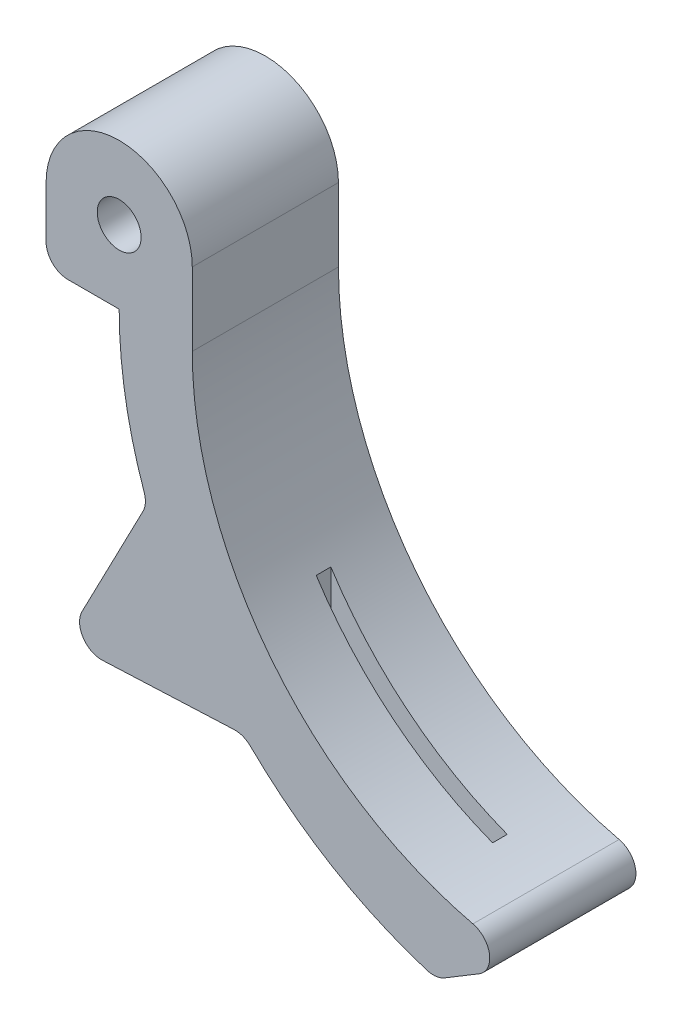
ISO-10303-21;
HEADER;
FILE_DESCRIPTION(('STEP AP214'),'2;1');
FILE_NAME('part.step','',(''),(''),'','','');
FILE_SCHEMA(('AUTOMOTIVE_DESIGN { 1 0 10303 214 1 1 1 1 }'));
ENDSEC;
DATA;
#1=APPLICATION_CONTEXT('core data for automotive mechanical design processes');
#2=APPLICATION_PROTOCOL_DEFINITION('international standard','automotive_design',2000,#1);
#3=PRODUCT_CONTEXT('',#1,'mechanical');
#4=PRODUCT('Part','Part','',(#3));
#5=PRODUCT_RELATED_PRODUCT_CATEGORY('part','',(#4));
#6=PRODUCT_DEFINITION_FORMATION('','',#4);
#7=PRODUCT_DEFINITION_CONTEXT('part definition',#1,'design');
#8=PRODUCT_DEFINITION('design','',#6,#7);
#9=PRODUCT_DEFINITION_SHAPE('','',#8);
#10=(LENGTH_UNIT() NAMED_UNIT(*) SI_UNIT(.MILLI.,.METRE.));
#11=(NAMED_UNIT(*) PLANE_ANGLE_UNIT() SI_UNIT($,.RADIAN.));
#12=(NAMED_UNIT(*) SI_UNIT($,.STERADIAN.) SOLID_ANGLE_UNIT());
#13=UNCERTAINTY_MEASURE_WITH_UNIT(LENGTH_MEASURE(1.E-05),#10,'distance_accuracy_value','');
#14=(GEOMETRIC_REPRESENTATION_CONTEXT(3) GLOBAL_UNCERTAINTY_ASSIGNED_CONTEXT((#13)) GLOBAL_UNIT_ASSIGNED_CONTEXT((#10,
#11,#12)) REPRESENTATION_CONTEXT('',''));
#15=CARTESIAN_POINT('',(0.,0.,0.));
#16=DIRECTION('',(0.,0.,1.));
#17=DIRECTION('',(1.,0.,0.));
#18=AXIS2_PLACEMENT_3D('',#15,#16,#17);
#19=CARTESIAN_POINT('',(30.,-5.,10.));
#20=DIRECTION('',(0.,0.,-1.));
#21=DIRECTION('',(-1.,0.,0.));
#22=AXIS2_PLACEMENT_3D('',#19,#20,#21);
#23=CYLINDRICAL_SURFACE('',#22,29.9999989888262);
#24=CARTESIAN_POINT('',(30.,-5.,4.5));
#25=DIRECTION('',(0.,0.,1.));
#26=DIRECTION('',(1.,0.,0.));
#27=AXIS2_PLACEMENT_3D('',#24,#25,#26);
#28=CIRCLE('',#27,29.9999989888262);
#29=CARTESIAN_POINT('',(8.97863673824008,-26.4033227781741,4.5));
#30=VERTEX_POINT('',#29);
#31=CARTESIAN_POINT('',(21.0443812891128,-33.6320944542096,4.5));
#32=VERTEX_POINT('',#31);
#33=EDGE_CURVE('E329',#30,#32,#28,.T.);
#34=ORIENTED_EDGE('',*,*,#33,.F.);
#35=DIRECTION('',(0.,0.,-1.));
#36=VECTOR('',#35,1.);
#37=CARTESIAN_POINT('',(8.97863673824008,-26.4033227781741,10.));
#38=LINE('',#37,#36);
#39=CARTESIAN_POINT('',(8.97863673824008,-26.4033227781741,0.));
#40=VERTEX_POINT('',#39);
#41=EDGE_CURVE('E200',#30,#40,#38,.T.);
#42=ORIENTED_EDGE('',*,*,#41,.T.);
#43=CARTESIAN_POINT('',(30.,-5.,0.));
#44=DIRECTION('',(0.,0.,1.));
#45=DIRECTION('',(1.,0.,0.));
#46=AXIS2_PLACEMENT_3D('',#43,#44,#45);
#47=CIRCLE('',#46,29.9999989888262);
#48=CARTESIAN_POINT('',(21.0443812891128,-33.6320944542096,0.));
#49=VERTEX_POINT('',#48);
#50=EDGE_CURVE('E291',#40,#49,#47,.T.);
#51=ORIENTED_EDGE('',*,*,#50,.T.);
#52=DIRECTION('',(0.,0.,-1.));
#53=VECTOR('',#52,1.);
#54=CARTESIAN_POINT('',(21.0443812891128,-33.6320944542096,10.));
#55=LINE('',#54,#53);
#56=EDGE_CURVE('E210',#49,#32,#55,.F.);
#57=ORIENTED_EDGE('',*,*,#56,.T.);
#58=EDGE_LOOP('',(#34,#42,#51,#57));
#59=FACE_BOUND('',#58,.T.);
#60=ADVANCED_FACE('F37',(#59),#23,.T.);
#61=CARTESIAN_POINT('',(30.,-5.,5.5));
#62=DIRECTION('',(0.,0.,-1.));
#63=DIRECTION('',(-1.,0.,0.));
#64=AXIS2_PLACEMENT_3D('',#61,#62,#63);
#65=CIRCLE('',#64,29.9999989888262);
#66=CARTESIAN_POINT('',(21.0443812891128,-33.6320944542096,5.5));
#67=VERTEX_POINT('',#66);
#68=CARTESIAN_POINT('',(8.97863673824008,-26.4033227781741,5.5));
#69=VERTEX_POINT('',#68);
#70=EDGE_CURVE('E172',#67,#69,#65,.T.);
#71=ORIENTED_EDGE('',*,*,#70,.F.);
#72=CARTESIAN_POINT('',(21.0443812891128,-33.6320944542096,10.));
#73=VERTEX_POINT('',#72);
#74=EDGE_CURVE('E216',#67,#73,#55,.F.);
#75=ORIENTED_EDGE('',*,*,#74,.T.);
#76=CARTESIAN_POINT('',(30.,-5.,10.));
#77=DIRECTION('',(0.,0.,1.));
#78=DIRECTION('',(1.,0.,0.));
#79=AXIS2_PLACEMENT_3D('',#76,#77,#78);
#80=CIRCLE('',#79,29.9999989888262);
#81=CARTESIAN_POINT('',(8.97863673824008,-26.4033227781741,10.));
#82=VERTEX_POINT('',#81);
#83=EDGE_CURVE('E205',#82,#73,#80,.T.);
#84=ORIENTED_EDGE('',*,*,#83,.F.);
#85=EDGE_CURVE('E198',#82,#69,#38,.T.);
#86=ORIENTED_EDGE('',*,*,#85,.T.);
#87=EDGE_LOOP('',(#71,#75,#84,#86));
#88=FACE_BOUND('',#87,.T.);
#89=ADVANCED_FACE('F203',(#88),#23,.T.);
#90=CARTESIAN_POINT('',(30.,-5.,10.));
#91=DIRECTION('',(0.,0.,-1.));
#92=DIRECTION('',(-1.,0.,0.));
#93=AXIS2_PLACEMENT_3D('',#90,#91,#92);
#94=CYLINDRICAL_SURFACE('',#93,25.);
#95=CARTESIAN_POINT('',(30.,-5.,10.));
#96=DIRECTION('',(0.,0.,1.));
#97=DIRECTION('',(1.,0.,0.));
#98=AXIS2_PLACEMENT_3D('',#95,#96,#97);
#99=CIRCLE('',#98,25.);
#100=CARTESIAN_POINT('',(5.,-5.,10.));
#101=VERTEX_POINT('',#100);
#102=CARTESIAN_POINT('',(24.197357034,-29.3172641267296,10.));
#103=VERTEX_POINT('',#102);
#104=EDGE_CURVE('E313',#101,#103,#99,.T.);
#105=ORIENTED_EDGE('',*,*,#104,.T.);
#106=DIRECTION('',(0.,0.,-1.));
#107=VECTOR('',#106,1.);
#108=CARTESIAN_POINT('',(24.197357034,-29.3172641267296,10.));
#109=LINE('',#108,#107);
#110=CARTESIAN_POINT('',(24.197357034,-29.3172641267296,0.));
#111=VERTEX_POINT('',#110);
#112=EDGE_CURVE('E364',#103,#111,#109,.T.);
#113=ORIENTED_EDGE('',*,*,#112,.T.);
#114=CARTESIAN_POINT('',(30.,-5.,0.));
#115=DIRECTION('',(0.,0.,1.));
#116=DIRECTION('',(1.,0.,0.));
#117=AXIS2_PLACEMENT_3D('',#114,#115,#116);
#118=CIRCLE('',#117,25.);
#119=CARTESIAN_POINT('',(5.,-5.,0.));
#120=VERTEX_POINT('',#119);
#121=EDGE_CURVE('E285',#120,#111,#118,.T.);
#122=ORIENTED_EDGE('',*,*,#121,.F.);
#123=DIRECTION('',(0.,0.,-1.));
#124=VECTOR('',#123,1.);
#125=CARTESIAN_POINT('',(5.,-5.,10.));
#126=LINE('',#125,#124);
#127=EDGE_CURVE('E257',#101,#120,#126,.T.);
#128=ORIENTED_EDGE('',*,*,#127,.F.);
#129=EDGE_LOOP('',(#105,#113,#122,#128));
#130=FACE_BOUND('',#129,.T.);
#131=CARTESIAN_POINT('',(30.,-5.,4.5));
#132=DIRECTION('',(0.,0.,1.));
#133=DIRECTION('',(1.,0.,0.));
#134=AXIS2_PLACEMENT_3D('',#131,#132,#133);
#135=CIRCLE('',#134,25.);
#136=CARTESIAN_POINT('',(8.97863673824008,-18.5315293524838,4.5));
#137=VERTEX_POINT('',#136);
#138=CARTESIAN_POINT('',(21.0443812891128,-28.3408845913176,4.5));
#139=VERTEX_POINT('',#138);
#140=EDGE_CURVE('E179',#137,#139,#135,.T.);
#141=ORIENTED_EDGE('',*,*,#140,.T.);
#142=DIRECTION('',(0.,0.,-1.));
#143=VECTOR('',#142,1.);
#144=CARTESIAN_POINT('',(21.0443812891128,-28.3408845913176,10.));
#145=LINE('',#144,#143);
#146=CARTESIAN_POINT('',(21.0443812891128,-28.3408845913176,5.5));
#147=VERTEX_POINT('',#146);
#148=EDGE_CURVE('E326',#139,#147,#145,.F.);
#149=ORIENTED_EDGE('',*,*,#148,.T.);
#150=CARTESIAN_POINT('',(30.,-5.,5.5));
#151=DIRECTION('',(0.,0.,-1.));
#152=DIRECTION('',(-1.,0.,0.));
#153=AXIS2_PLACEMENT_3D('',#150,#151,#152);
#154=CIRCLE('',#153,25.);
#155=CARTESIAN_POINT('',(8.97863673824009,-18.5315293524838,5.5));
#156=VERTEX_POINT('',#155);
#157=EDGE_CURVE('E180',#147,#156,#154,.T.);
#158=ORIENTED_EDGE('',*,*,#157,.T.);
#159=DIRECTION('',(0.,0.,-1.));
#160=VECTOR('',#159,1.);
#161=CARTESIAN_POINT('',(8.97863673824009,-18.5315293524838,10.));
#162=LINE('',#161,#160);
#163=EDGE_CURVE('E189',#156,#137,#162,.T.);
#164=ORIENTED_EDGE('',*,*,#163,.T.);
#165=EDGE_LOOP('',(#141,#149,#158,#164));
#166=FACE_BOUND('',#165,.T.);
#167=ADVANCED_FACE('F345',(#130,#166),#94,.F.);
#168=CARTESIAN_POINT('',(1.1615210425008,-26.2711692628957,10.));
#169=DIRECTION('',(-0.0441696157527553,0.999024046279295,0.));
#170=DIRECTION('',(-0.999024046279295,-0.0441696157527553,0.));
#171=AXIS2_PLACEMENT_3D('',#168,#169,#170);
#172=PLANE('',#171);
#173=DIRECTION('',(0.999024046279295,0.0441696157527553,0.));
#174=VECTOR('',#173,1.);
#175=CARTESIAN_POINT('',(1.1615210425008,-26.2711692628957,10.));
#176=LINE('',#175,#174);
#177=CARTESIAN_POINT('',(-1.14277252574677,-26.3730484537621,10.));
#178=VERTEX_POINT('',#177);
#179=CARTESIAN_POINT('',(7.86131411609586,-25.9749528837346,10.));
#180=VERTEX_POINT('',#179);
#181=EDGE_CURVE('E320',#178,#180,#176,.T.);
#182=ORIENTED_EDGE('',*,*,#181,.F.);
#183=DIRECTION('',(0.,0.,-1.));
#184=VECTOR('',#183,1.);
#185=CARTESIAN_POINT('',(-1.14277252574677,-26.3730484537621,10.));
#186=LINE('',#185,#184);
#187=CARTESIAN_POINT('',(-1.14277252574677,-26.3730484537621,0.));
#188=VERTEX_POINT('',#187);
#189=EDGE_CURVE('E219',#178,#188,#186,.T.);
#190=ORIENTED_EDGE('',*,*,#189,.T.);
#191=DIRECTION('',(0.999024046279295,0.0441696157527553,0.));
#192=VECTOR('',#191,1.);
#193=CARTESIAN_POINT('',(1.1615210425008,-26.2711692628957,0.));
#194=LINE('',#193,#192);
#195=CARTESIAN_POINT('',(7.86131411609586,-25.9749528837346,0.));
#196=VERTEX_POINT('',#195);
#197=EDGE_CURVE('E293',#188,#196,#194,.T.);
#198=ORIENTED_EDGE('',*,*,#197,.T.);
#199=DIRECTION('',(0.,0.,1.));
#200=VECTOR('',#199,1.);
#201=CARTESIAN_POINT('',(7.86131411609586,-25.9749528837346,10.));
#202=LINE('',#201,#200);
#203=EDGE_CURVE('E221',#196,#180,#202,.T.);
#204=ORIENTED_EDGE('',*,*,#203,.T.);
#205=EDGE_LOOP('',(#182,#190,#198,#204));
#206=FACE_BOUND('',#205,.T.);
#207=ADVANCED_FACE('F418',(#206),#172,.F.);
#208=CARTESIAN_POINT('',(20.7766465222511,-34.3853827896279,10.));
#209=DIRECTION('',(0.517154742988662,-0.855891915959212,0.));
#210=DIRECTION('',(0.855891915959212,0.517154742988662,0.));
#211=AXIS2_PLACEMENT_3D('',#208,#209,#210);
#212=PLANE('',#211);
#213=DIRECTION('',(-0.855891915959212,-0.517154742988662,0.));
#214=VECTOR('',#213,1.);
#215=CARTESIAN_POINT('',(20.7766465222511,-34.3853827896279,10.));
#216=LINE('',#215,#214);
#217=CARTESIAN_POINT('',(24.624930570523,-32.0601378482722,10.));
#218=VERTEX_POINT('',#217);
#219=CARTESIAN_POINT('',(22.267894354233,-33.4843275571846,10.));
#220=VERTEX_POINT('',#219);
#221=EDGE_CURVE('E316',#218,#220,#216,.T.);
#222=ORIENTED_EDGE('',*,*,#221,.T.);
#223=DIRECTION('',(0.,0.,1.));
#224=VECTOR('',#223,1.);
#225=CARTESIAN_POINT('',(22.267894354233,-33.4843275571846,0.));
#226=LINE('',#225,#224);
#227=CARTESIAN_POINT('',(22.267894354233,-33.4843275571846,0.));
#228=VERTEX_POINT('',#227);
#229=EDGE_CURVE('E207',#220,#228,#226,.F.);
#230=ORIENTED_EDGE('',*,*,#229,.T.);
#231=DIRECTION('',(-0.855891915959212,-0.517154742988662,0.));
#232=VECTOR('',#231,1.);
#233=CARTESIAN_POINT('',(20.7766465222511,-34.3853827896279,0.));
#234=LINE('',#233,#232);
#235=CARTESIAN_POINT('',(24.624930570523,-32.0601378482722,0.));
#236=VERTEX_POINT('',#235);
#237=EDGE_CURVE('E288',#236,#228,#234,.T.);
#238=ORIENTED_EDGE('',*,*,#237,.F.);
#239=DIRECTION('',(0.,0.,-1.));
#240=VECTOR('',#239,1.);
#241=CARTESIAN_POINT('',(24.624930570523,-32.0601378482722,10.));
#242=LINE('',#241,#240);
#243=EDGE_CURVE('E206',#236,#218,#242,.F.);
#244=ORIENTED_EDGE('',*,*,#243,.T.);
#245=EDGE_LOOP('',(#222,#230,#238,#244));
#246=FACE_BOUND('',#245,.T.);
#247=ADVANCED_FACE('F358',(#246),#212,.T.);
#248=CARTESIAN_POINT('',(5.,0.,10.));
#249=DIRECTION('',(1.,0.,0.));
#250=DIRECTION('',(0.,1.,0.));
#251=AXIS2_PLACEMENT_3D('',#248,#249,#250);
#252=PLANE('',#251);
#253=DIRECTION('',(0.,-1.,0.));
#254=VECTOR('',#253,1.);
#255=CARTESIAN_POINT('',(5.,0.,0.));
#256=LINE('',#255,#254);
#257=CARTESIAN_POINT('',(5.,0.,0.));
#258=VERTEX_POINT('',#257);
#259=EDGE_CURVE('E282',#258,#120,#256,.T.);
#260=ORIENTED_EDGE('',*,*,#259,.F.);
#261=DIRECTION('',(0.,0.,-1.));
#262=VECTOR('',#261,1.);
#263=CARTESIAN_POINT('',(5.,0.,10.));
#264=LINE('',#263,#262);
#265=CARTESIAN_POINT('',(5.,0.,10.));
#266=VERTEX_POINT('',#265);
#267=EDGE_CURVE('E259',#266,#258,#264,.T.);
#268=ORIENTED_EDGE('',*,*,#267,.F.);
#269=DIRECTION('',(0.,-1.,0.));
#270=VECTOR('',#269,1.);
#271=CARTESIAN_POINT('',(5.,0.,10.));
#272=LINE('',#271,#270);
#273=EDGE_CURVE('E310',#266,#101,#272,.T.);
#274=ORIENTED_EDGE('',*,*,#273,.T.);
#275=ORIENTED_EDGE('',*,*,#127,.T.);
#276=EDGE_LOOP('',(#260,#268,#274,#275));
#277=FACE_BOUND('',#276,.T.);
#278=ADVANCED_FACE('F371',(#277),#252,.T.);
#279=CARTESIAN_POINT('',(0.,0.,10.));
#280=DIRECTION('',(0.,0.,-1.));
#281=DIRECTION('',(-1.,0.,0.));
#282=AXIS2_PLACEMENT_3D('',#279,#280,#281);
#283=CYLINDRICAL_SURFACE('',#282,5.);
#284=CARTESIAN_POINT('',(0.,0.,0.));
#285=DIRECTION('',(0.,0.,1.));
#286=DIRECTION('',(1.,0.,0.));
#287=AXIS2_PLACEMENT_3D('',#284,#285,#286);
#288=CIRCLE('',#287,5.);
#289=CARTESIAN_POINT('',(-5.,0.,0.));
#290=VERTEX_POINT('',#289);
#291=EDGE_CURVE('E280',#258,#290,#288,.T.);
#292=ORIENTED_EDGE('',*,*,#291,.T.);
#293=DIRECTION('',(0.,0.,-1.));
#294=VECTOR('',#293,1.);
#295=CARTESIAN_POINT('',(-5.,0.,10.));
#296=LINE('',#295,#294);
#297=CARTESIAN_POINT('',(-5.,0.,10.));
#298=VERTEX_POINT('',#297);
#299=EDGE_CURVE('E261',#298,#290,#296,.T.);
#300=ORIENTED_EDGE('',*,*,#299,.F.);
#301=CARTESIAN_POINT('',(0.,0.,10.));
#302=DIRECTION('',(0.,0.,1.));
#303=DIRECTION('',(1.,0.,0.));
#304=AXIS2_PLACEMENT_3D('',#301,#302,#303);
#305=CIRCLE('',#304,5.);
#306=EDGE_CURVE('E308',#266,#298,#305,.T.);
#307=ORIENTED_EDGE('',*,*,#306,.F.);
#308=ORIENTED_EDGE('',*,*,#267,.T.);
#309=EDGE_LOOP('',(#292,#300,#307,#308));
#310=FACE_BOUND('',#309,.T.);
#311=ADVANCED_FACE('F377',(#310),#283,.T.);
#312=CARTESIAN_POINT('',(-5.,0.,10.));
#313=DIRECTION('',(1.,0.,0.));
#314=DIRECTION('',(0.,1.,0.));
#315=AXIS2_PLACEMENT_3D('',#312,#313,#314);
#316=PLANE('',#315);
#317=DIRECTION('',(0.,-1.,0.));
#318=VECTOR('',#317,1.);
#319=CARTESIAN_POINT('',(-5.,0.,0.));
#320=LINE('',#319,#318);
#321=CARTESIAN_POINT('',(-5.,-3.5,0.));
#322=VERTEX_POINT('',#321);
#323=EDGE_CURVE('E277',#290,#322,#320,.T.);
#324=ORIENTED_EDGE('',*,*,#323,.T.);
#325=DIRECTION('',(0.,0.,-1.));
#326=VECTOR('',#325,1.);
#327=CARTESIAN_POINT('',(-5.,-3.5,10.));
#328=LINE('',#327,#326);
#329=CARTESIAN_POINT('',(-5.,-3.5,10.));
#330=VERTEX_POINT('',#329);
#331=EDGE_CURVE('E244',#322,#330,#328,.F.);
#332=ORIENTED_EDGE('',*,*,#331,.T.);
#333=DIRECTION('',(0.,-1.,0.));
#334=VECTOR('',#333,1.);
#335=CARTESIAN_POINT('',(-5.,0.,10.));
#336=LINE('',#335,#334);
#337=EDGE_CURVE('E305',#298,#330,#336,.T.);
#338=ORIENTED_EDGE('',*,*,#337,.F.);
#339=ORIENTED_EDGE('',*,*,#299,.T.);
#340=EDGE_LOOP('',(#324,#332,#338,#339));
#341=FACE_BOUND('',#340,.T.);
#342=ADVANCED_FACE('F381',(#341),#316,.F.);
#343=CARTESIAN_POINT('',(0.,-5.,10.));
#344=DIRECTION('',(0.,1.,0.));
#345=DIRECTION('',(-1.,0.,0.));
#346=AXIS2_PLACEMENT_3D('',#343,#344,#345);
#347=PLANE('',#346);
#348=DIRECTION('',(1.,0.,0.));
#349=VECTOR('',#348,1.);
#350=CARTESIAN_POINT('',(0.,-5.,10.));
#351=LINE('',#350,#349);
#352=CARTESIAN_POINT('',(-3.5,-5.,10.));
#353=VERTEX_POINT('',#352);
#354=CARTESIAN_POINT('',(1.01117377318549E-06,-5.,10.));
#355=VERTEX_POINT('',#354);
#356=EDGE_CURVE('E303',#353,#355,#351,.T.);
#357=ORIENTED_EDGE('',*,*,#356,.F.);
#358=DIRECTION('',(0.,0.,-1.));
#359=VECTOR('',#358,1.);
#360=CARTESIAN_POINT('',(-3.5,-5.,10.));
#361=LINE('',#360,#359);
#362=CARTESIAN_POINT('',(-3.5,-5.,0.));
#363=VERTEX_POINT('',#362);
#364=EDGE_CURVE('E254',#353,#363,#361,.T.);
#365=ORIENTED_EDGE('',*,*,#364,.T.);
#366=DIRECTION('',(1.,0.,0.));
#367=VECTOR('',#366,1.);
#368=CARTESIAN_POINT('',(0.,-5.,0.));
#369=LINE('',#368,#367);
#370=CARTESIAN_POINT('',(1.01117377318549E-06,-5.,0.));
#371=VERTEX_POINT('',#370);
#372=EDGE_CURVE('E275',#363,#371,#369,.T.);
#373=ORIENTED_EDGE('',*,*,#372,.T.);
#374=DIRECTION('',(0.,0.,-1.));
#375=VECTOR('',#374,1.);
#376=CARTESIAN_POINT('',(1.01117377318549E-06,-5.,10.));
#377=LINE('',#376,#375);
#378=EDGE_CURVE('E264',#355,#371,#377,.T.);
#379=ORIENTED_EDGE('',*,*,#378,.F.);
#380=EDGE_LOOP('',(#357,#365,#373,#379));
#381=FACE_BOUND('',#380,.T.);
#382=ADVANCED_FACE('F389',(#381),#347,.F.);
#383=CARTESIAN_POINT('',(30.,-5.,10.));
#384=DIRECTION('',(0.,0.,-1.));
#385=DIRECTION('',(-1.,0.,0.));
#386=AXIS2_PLACEMENT_3D('',#383,#384,#385);
#387=CYLINDRICAL_SURFACE('',#386,29.9999989888262);
#388=CARTESIAN_POINT('',(30.,-5.,0.));
#389=DIRECTION('',(0.,0.,1.));
#390=DIRECTION('',(1.,0.,0.));
#391=AXIS2_PLACEMENT_3D('',#388,#389,#390);
#392=CIRCLE('',#391,29.9999989888262);
#393=CARTESIAN_POINT('',(1.70871106394565,-14.9801257339907,0.));
#394=VERTEX_POINT('',#393);
#395=EDGE_CURVE('E272',#371,#394,#392,.T.);
#396=ORIENTED_EDGE('',*,*,#395,.T.);
#397=DIRECTION('',(0.,0.,-1.));
#398=VECTOR('',#397,1.);
#399=CARTESIAN_POINT('',(1.70871106394565,-14.9801257339907,10.));
#400=LINE('',#399,#398);
#401=CARTESIAN_POINT('',(1.70871106394565,-14.9801257339907,10.));
#402=VERTEX_POINT('',#401);
#403=EDGE_CURVE('E227',#394,#402,#400,.F.);
#404=ORIENTED_EDGE('',*,*,#403,.T.);
#405=CARTESIAN_POINT('',(30.,-5.,10.));
#406=DIRECTION('',(0.,0.,1.));
#407=DIRECTION('',(1.,0.,0.));
#408=AXIS2_PLACEMENT_3D('',#405,#406,#407);
#409=CIRCLE('',#408,29.9999989888262);
#410=EDGE_CURVE('E300',#355,#402,#409,.T.);
#411=ORIENTED_EDGE('',*,*,#410,.F.);
#412=ORIENTED_EDGE('',*,*,#378,.T.);
#413=EDGE_LOOP('',(#396,#404,#411,#412));
#414=FACE_BOUND('',#413,.T.);
#415=ADVANCED_FACE('F394',(#414),#387,.T.);
#416=CARTESIAN_POINT('',(0.,0.,10.));
#417=DIRECTION('',(0.,0.,-1.));
#418=DIRECTION('',(-1.,0.,0.));
#419=AXIS2_PLACEMENT_3D('',#416,#417,#418);
#420=CYLINDRICAL_SURFACE('',#419,1.5);
#421=CARTESIAN_POINT('',(0.,0.,10.));
#422=DIRECTION('',(0.,0.,1.));
#423=DIRECTION('',(1.,0.,0.));
#424=AXIS2_PLACEMENT_3D('',#421,#422,#423);
#425=CIRCLE('',#424,1.5);
#426=CARTESIAN_POINT('',(1.5,0.,10.));
#427=VERTEX_POINT('',#426);
#428=EDGE_CURVE('E271',#427,#427,#425,.T.);
#429=ORIENTED_EDGE('',*,*,#428,.T.);
#430=EDGE_LOOP('',(#429));
#431=FACE_BOUND('',#430,.T.);
#432=CARTESIAN_POINT('',(0.,0.,0.));
#433=DIRECTION('',(0.,0.,1.));
#434=DIRECTION('',(1.,0.,0.));
#435=AXIS2_PLACEMENT_3D('',#432,#433,#434);
#436=CIRCLE('',#435,1.5);
#437=CARTESIAN_POINT('',(1.5,0.,0.));
#438=VERTEX_POINT('',#437);
#439=EDGE_CURVE('E295',#438,#438,#436,.T.);
#440=ORIENTED_EDGE('',*,*,#439,.F.);
#441=EDGE_LOOP('',(#440));
#442=FACE_BOUND('',#441,.T.);
#443=ADVANCED_FACE('F429',(#431,#442),#420,.F.);
#444=CARTESIAN_POINT('',(7.89744881050216,-4.10562492891574,10.));
#445=DIRECTION('',(0.887265010945767,-0.461260013822364,0.));
#446=DIRECTION('',(0.461260013822364,0.887265010945767,0.));
#447=AXIS2_PLACEMENT_3D('',#444,#445,#446);
#448=PLANE('',#447);
#449=DIRECTION('',(-0.461260013822364,-0.887265010945767,0.));
#450=VECTOR('',#449,1.);
#451=CARTESIAN_POINT('',(7.89744881050216,-4.10562492891574,10.));
#452=LINE('',#451,#450);
#453=CARTESIAN_POINT('',(1.62504408588257,-16.1710220582432,10.));
#454=VERTEX_POINT('',#453);
#455=CARTESIAN_POINT('',(-2.53992446579455,-24.1826223636096,10.));
#456=VERTEX_POINT('',#455);
#457=EDGE_CURVE('E267',#454,#456,#452,.T.);
#458=ORIENTED_EDGE('',*,*,#457,.F.);
#459=DIRECTION('',(0.,0.,1.));
#460=VECTOR('',#459,1.);
#461=CARTESIAN_POINT('',(1.62504408588257,-16.1710220582432,0.));
#462=LINE('',#461,#460);
#463=CARTESIAN_POINT('',(1.62504408588257,-16.1710220582432,0.));
#464=VERTEX_POINT('',#463);
#465=EDGE_CURVE('E231',#454,#464,#462,.F.);
#466=ORIENTED_EDGE('',*,*,#465,.T.);
#467=DIRECTION('',(-0.461260013822364,-0.887265010945767,0.));
#468=VECTOR('',#467,1.);
#469=CARTESIAN_POINT('',(7.89744881050216,-4.10562492891574,0.));
#470=LINE('',#469,#468);
#471=CARTESIAN_POINT('',(-2.53992446579455,-24.1826223636096,0.));
#472=VERTEX_POINT('',#471);
#473=EDGE_CURVE('E268',#464,#472,#470,.T.);
#474=ORIENTED_EDGE('',*,*,#473,.T.);
#475=DIRECTION('',(0.,0.,-1.));
#476=VECTOR('',#475,1.);
#477=CARTESIAN_POINT('',(-2.53992446579455,-24.1826223636096,10.));
#478=LINE('',#477,#476);
#479=EDGE_CURVE('E234',#472,#456,#478,.F.);
#480=ORIENTED_EDGE('',*,*,#479,.T.);
#481=EDGE_LOOP('',(#458,#466,#474,#480));
#482=FACE_BOUND('',#481,.T.);
#483=ADVANCED_FACE('F411',(#482),#448,.F.);
#484=CARTESIAN_POINT('',(0.,0.,10.));
#485=DIRECTION('',(0.,0.,1.));
#486=DIRECTION('',(1.,0.,0.));
#487=AXIS2_PLACEMENT_3D('',#484,#485,#486);
#488=PLANE('',#487);
#489=ORIENTED_EDGE('',*,*,#428,.F.);
#490=EDGE_LOOP('',(#489));
#491=FACE_BOUND('',#490,.T.);
#492=ORIENTED_EDGE('',*,*,#337,.T.);
#493=CARTESIAN_POINT('',(-3.5,-3.5,10.));
#494=DIRECTION('',(0.,0.,1.));
#495=DIRECTION('',(1.,0.,0.));
#496=AXIS2_PLACEMENT_3D('',#493,#494,#495);
#497=CIRCLE('',#496,1.5);
#498=EDGE_CURVE('E236',#330,#353,#497,.T.);
#499=ORIENTED_EDGE('',*,*,#498,.T.);
#500=ORIENTED_EDGE('',*,*,#356,.T.);
#501=ORIENTED_EDGE('',*,*,#410,.T.);
#502=CARTESIAN_POINT('',(0.294146569463919,-15.4791320375096,10.));
#503=DIRECTION('',(0.,0.,1.));
#504=DIRECTION('',(1.,0.,0.));
#505=AXIS2_PLACEMENT_3D('',#502,#503,#504);
#506=CIRCLE('',#505,1.5);
#507=EDGE_CURVE('E397',#402,#454,#506,.F.);
#508=ORIENTED_EDGE('',*,*,#507,.T.);
#509=ORIENTED_EDGE('',*,*,#457,.T.);
#510=CARTESIAN_POINT('',(-1.2090269493759,-24.8745123843432,10.));
#511=DIRECTION('',(0.,0.,1.));
#512=DIRECTION('',(1.,0.,0.));
#513=AXIS2_PLACEMENT_3D('',#510,#511,#512);
#514=CIRCLE('',#513,1.5);
#515=EDGE_CURVE('E238',#456,#178,#514,.T.);
#516=ORIENTED_EDGE('',*,*,#515,.T.);
#517=ORIENTED_EDGE('',*,*,#181,.T.);
#518=CARTESIAN_POINT('',(7.92756853972499,-27.4734889531536,10.));
#519=DIRECTION('',(0.,0.,1.));
#520=DIRECTION('',(1.,0.,0.));
#521=AXIS2_PLACEMENT_3D('',#518,#519,#520);
#522=CIRCLE('',#521,1.5);
#523=EDGE_CURVE('E12',#180,#82,#522,.F.);
#524=ORIENTED_EDGE('',*,*,#523,.T.);
#525=ORIENTED_EDGE('',*,*,#83,.T.);
#526=CARTESIAN_POINT('',(21.49216223975,-32.2004896832458,10.));
#527=DIRECTION('',(0.,0.,1.));
#528=DIRECTION('',(1.,0.,0.));
#529=AXIS2_PLACEMENT_3D('',#526,#527,#528);
#530=CIRCLE('',#529,1.5);
#531=EDGE_CURVE('E240',#73,#220,#530,.T.);
#532=ORIENTED_EDGE('',*,*,#531,.T.);
#533=ORIENTED_EDGE('',*,*,#221,.F.);
#534=CARTESIAN_POINT('',(23.84919845604,-30.7762999743334,10.));
#535=DIRECTION('',(0.,0.,1.));
#536=DIRECTION('',(1.,0.,0.));
#537=AXIS2_PLACEMENT_3D('',#534,#535,#536);
#538=CIRCLE('',#537,1.5);
#539=EDGE_CURVE('E242',#218,#103,#538,.T.);
#540=ORIENTED_EDGE('',*,*,#539,.T.);
#541=ORIENTED_EDGE('',*,*,#104,.F.);
#542=ORIENTED_EDGE('',*,*,#273,.F.);
#543=ORIENTED_EDGE('',*,*,#306,.T.);
#544=EDGE_LOOP('',(#492,#499,#500,#501,#508,#509,#516,#517,#524,#525,#532,#533,#540,#541,#542,#543));
#545=FACE_BOUND('',#544,.T.);
#546=ADVANCED_FACE('F355',(#491,#545),#488,.T.);
#547=CARTESIAN_POINT('',(0.,0.,0.));
#548=DIRECTION('',(0.,0.,1.));
#549=DIRECTION('',(1.,0.,0.));
#550=AXIS2_PLACEMENT_3D('',#547,#548,#549);
#551=PLANE('',#550);
#552=ORIENTED_EDGE('',*,*,#439,.T.);
#553=EDGE_LOOP('',(#552));
#554=FACE_BOUND('',#553,.T.);
#555=ORIENTED_EDGE('',*,*,#372,.F.);
#556=CARTESIAN_POINT('',(-3.5,-3.5,0.));
#557=DIRECTION('',(0.,0.,1.));
#558=DIRECTION('',(1.,0.,0.));
#559=AXIS2_PLACEMENT_3D('',#556,#557,#558);
#560=CIRCLE('',#559,1.5);
#561=EDGE_CURVE('E246',#363,#322,#560,.F.);
#562=ORIENTED_EDGE('',*,*,#561,.T.);
#563=ORIENTED_EDGE('',*,*,#323,.F.);
#564=ORIENTED_EDGE('',*,*,#291,.F.);
#565=ORIENTED_EDGE('',*,*,#259,.T.);
#566=ORIENTED_EDGE('',*,*,#121,.T.);
#567=CARTESIAN_POINT('',(23.84919845604,-30.7762999743334,0.));
#568=DIRECTION('',(0.,0.,1.));
#569=DIRECTION('',(1.,0.,0.));
#570=AXIS2_PLACEMENT_3D('',#567,#568,#569);
#571=CIRCLE('',#570,1.5);
#572=EDGE_CURVE('E252',#111,#236,#571,.F.);
#573=ORIENTED_EDGE('',*,*,#572,.T.);
#574=ORIENTED_EDGE('',*,*,#237,.T.);
#575=CARTESIAN_POINT('',(21.49216223975,-32.2004896832458,0.));
#576=DIRECTION('',(0.,0.,1.));
#577=DIRECTION('',(1.,0.,0.));
#578=AXIS2_PLACEMENT_3D('',#575,#576,#577);
#579=CIRCLE('',#578,1.5);
#580=EDGE_CURVE('E250',#228,#49,#579,.F.);
#581=ORIENTED_EDGE('',*,*,#580,.T.);
#582=ORIENTED_EDGE('',*,*,#50,.F.);
#583=CARTESIAN_POINT('',(7.92756853972499,-27.4734889531536,0.));
#584=DIRECTION('',(0.,0.,1.));
#585=DIRECTION('',(1.,0.,0.));
#586=AXIS2_PLACEMENT_3D('',#583,#584,#585);
#587=CIRCLE('',#586,1.5);
#588=EDGE_CURVE('E45',#40,#196,#587,.T.);
#589=ORIENTED_EDGE('',*,*,#588,.T.);
#590=ORIENTED_EDGE('',*,*,#197,.F.);
#591=CARTESIAN_POINT('',(-1.2090269493759,-24.8745123843432,0.));
#592=DIRECTION('',(0.,0.,1.));
#593=DIRECTION('',(1.,0.,0.));
#594=AXIS2_PLACEMENT_3D('',#591,#592,#593);
#595=CIRCLE('',#594,1.5);
#596=EDGE_CURVE('E248',#188,#472,#595,.F.);
#597=ORIENTED_EDGE('',*,*,#596,.T.);
#598=ORIENTED_EDGE('',*,*,#473,.F.);
#599=CARTESIAN_POINT('',(0.294146569463919,-15.4791320375096,0.));
#600=DIRECTION('',(0.,0.,1.));
#601=DIRECTION('',(1.,0.,0.));
#602=AXIS2_PLACEMENT_3D('',#599,#600,#601);
#603=CIRCLE('',#602,1.5);
#604=EDGE_CURVE('E402',#464,#394,#603,.T.);
#605=ORIENTED_EDGE('',*,*,#604,.T.);
#606=ORIENTED_EDGE('',*,*,#395,.F.);
#607=EDGE_LOOP('',(#555,#562,#563,#564,#565,#566,#573,#574,#581,#582,#589,#590,#597,#598,#605,#606));
#608=FACE_BOUND('',#607,.T.);
#609=ADVANCED_FACE('F409',(#554,#608),#551,.F.);
#610=CARTESIAN_POINT('',(-3.5,-3.5,10.));
#611=DIRECTION('',(0.,0.,-1.));
#612=DIRECTION('',(-1.,0.,0.));
#613=AXIS2_PLACEMENT_3D('',#610,#611,#612);
#614=CYLINDRICAL_SURFACE('',#613,1.5);
#615=ORIENTED_EDGE('',*,*,#498,.F.);
#616=ORIENTED_EDGE('',*,*,#331,.F.);
#617=ORIENTED_EDGE('',*,*,#561,.F.);
#618=ORIENTED_EDGE('',*,*,#364,.F.);
#619=EDGE_LOOP('',(#615,#616,#617,#618));
#620=FACE_BOUND('',#619,.T.);
#621=ADVANCED_FACE('F384',(#620),#614,.T.);
#622=CARTESIAN_POINT('',(0.294146569463919,-15.4791320375096,10.));
#623=DIRECTION('',(0.,0.,-1.));
#624=DIRECTION('',(-1.,0.,0.));
#625=AXIS2_PLACEMENT_3D('',#622,#623,#624);
#626=CYLINDRICAL_SURFACE('',#625,1.5);
#627=ORIENTED_EDGE('',*,*,#507,.F.);
#628=ORIENTED_EDGE('',*,*,#403,.F.);
#629=ORIENTED_EDGE('',*,*,#604,.F.);
#630=ORIENTED_EDGE('',*,*,#465,.F.);
#631=EDGE_LOOP('',(#627,#628,#629,#630));
#632=FACE_BOUND('',#631,.T.);
#633=ADVANCED_FACE('F401',(#632),#626,.F.);
#634=CARTESIAN_POINT('',(-1.2090269493759,-24.8745123843432,10.));
#635=DIRECTION('',(0.,0.,-1.));
#636=DIRECTION('',(-1.,0.,0.));
#637=AXIS2_PLACEMENT_3D('',#634,#635,#636);
#638=CYLINDRICAL_SURFACE('',#637,1.5);
#639=ORIENTED_EDGE('',*,*,#515,.F.);
#640=ORIENTED_EDGE('',*,*,#479,.F.);
#641=ORIENTED_EDGE('',*,*,#596,.F.);
#642=ORIENTED_EDGE('',*,*,#189,.F.);
#643=EDGE_LOOP('',(#639,#640,#641,#642));
#644=FACE_BOUND('',#643,.T.);
#645=ADVANCED_FACE('F415',(#644),#638,.T.);
#646=CARTESIAN_POINT('',(7.92756853972499,-27.4734889531536,10.));
#647=DIRECTION('',(0.,0.,-1.));
#648=DIRECTION('',(-1.,0.,0.));
#649=AXIS2_PLACEMENT_3D('',#646,#647,#648);
#650=CYLINDRICAL_SURFACE('',#649,1.5);
#651=ORIENTED_EDGE('',*,*,#523,.F.);
#652=ORIENTED_EDGE('',*,*,#203,.F.);
#653=ORIENTED_EDGE('',*,*,#588,.F.);
#654=ORIENTED_EDGE('',*,*,#41,.F.);
#655=EDGE_CURVE('E186',#69,#30,#38,.T.);
#656=ORIENTED_EDGE('',*,*,#655,.F.);
#657=ORIENTED_EDGE('',*,*,#85,.F.);
#658=EDGE_LOOP('',(#651,#652,#653,#654,#656,#657));
#659=FACE_BOUND('',#658,.T.);
#660=ADVANCED_FACE('F197',(#659),#650,.F.);
#661=CARTESIAN_POINT('',(21.49216223975,-32.2004896832458,10.));
#662=DIRECTION('',(0.,0.,-1.));
#663=DIRECTION('',(-1.,0.,0.));
#664=AXIS2_PLACEMENT_3D('',#661,#662,#663);
#665=CYLINDRICAL_SURFACE('',#664,1.5);
#666=ORIENTED_EDGE('',*,*,#531,.F.);
#667=ORIENTED_EDGE('',*,*,#74,.F.);
#668=EDGE_CURVE('E215',#32,#67,#55,.F.);
#669=ORIENTED_EDGE('',*,*,#668,.F.);
#670=ORIENTED_EDGE('',*,*,#56,.F.);
#671=ORIENTED_EDGE('',*,*,#580,.F.);
#672=ORIENTED_EDGE('',*,*,#229,.F.);
#673=EDGE_LOOP('',(#666,#667,#669,#670,#671,#672));
#674=FACE_BOUND('',#673,.T.);
#675=ADVANCED_FACE('F350',(#674),#665,.T.);
#676=CARTESIAN_POINT('',(23.84919845604,-30.7762999743334,10.));
#677=DIRECTION('',(0.,0.,-1.));
#678=DIRECTION('',(-1.,0.,0.));
#679=AXIS2_PLACEMENT_3D('',#676,#677,#678);
#680=CYLINDRICAL_SURFACE('',#679,1.5);
#681=ORIENTED_EDGE('',*,*,#539,.F.);
#682=ORIENTED_EDGE('',*,*,#243,.F.);
#683=ORIENTED_EDGE('',*,*,#572,.F.);
#684=ORIENTED_EDGE('',*,*,#112,.F.);
#685=EDGE_LOOP('',(#681,#682,#683,#684));
#686=FACE_BOUND('',#685,.T.);
#687=ADVANCED_FACE('F39',(#686),#680,.T.);
#688=CARTESIAN_POINT('',(8.97863673824008,-26.4033227781741,5.5));
#689=DIRECTION('',(1.,0.,0.));
#690=DIRECTION('',(0.,0.,-1.));
#691=AXIS2_PLACEMENT_3D('',#688,#689,#690);
#692=PLANE('',#691);
#693=DIRECTION('',(0.,1.,0.));
#694=VECTOR('',#693,1.);
#695=CARTESIAN_POINT('',(8.97863673824008,-26.4033227781741,5.5));
#696=LINE('',#695,#694);
#697=EDGE_CURVE('E52',#69,#156,#696,.T.);
#698=ORIENTED_EDGE('',*,*,#697,.F.);
#699=ORIENTED_EDGE('',*,*,#655,.T.);
#700=DIRECTION('',(0.,1.,0.));
#701=VECTOR('',#700,1.);
#702=CARTESIAN_POINT('',(8.97863673824008,-26.4033227781741,4.5));
#703=LINE('',#702,#701);
#704=EDGE_CURVE('E191',#30,#137,#703,.T.);
#705=ORIENTED_EDGE('',*,*,#704,.T.);
#706=ORIENTED_EDGE('',*,*,#163,.F.);
#707=EDGE_LOOP('',(#698,#699,#705,#706));
#708=FACE_BOUND('',#707,.T.);
#709=ADVANCED_FACE('F184',(#708),#692,.T.);
#710=CARTESIAN_POINT('',(21.0443812891128,-33.6320944542096,4.5));
#711=DIRECTION('',(0.,0.,1.));
#712=DIRECTION('',(1.,0.,0.));
#713=AXIS2_PLACEMENT_3D('',#710,#711,#712);
#714=PLANE('',#713);
#715=ORIENTED_EDGE('',*,*,#33,.T.);
#716=DIRECTION('',(0.,1.,0.));
#717=VECTOR('',#716,1.);
#718=CARTESIAN_POINT('',(21.0443812891128,-33.6320944542096,4.5));
#719=LINE('',#718,#717);
#720=EDGE_CURVE('E60',#32,#139,#719,.T.);
#721=ORIENTED_EDGE('',*,*,#720,.T.);
#722=ORIENTED_EDGE('',*,*,#140,.F.);
#723=ORIENTED_EDGE('',*,*,#704,.F.);
#724=EDGE_LOOP('',(#715,#721,#722,#723));
#725=FACE_BOUND('',#724,.T.);
#726=ADVANCED_FACE('F447',(#725),#714,.T.);
#727=CARTESIAN_POINT('',(21.0443812891128,-33.6320944542096,5.5));
#728=DIRECTION('',(0.,0.,-1.));
#729=DIRECTION('',(-1.,0.,0.));
#730=AXIS2_PLACEMENT_3D('',#727,#728,#729);
#731=PLANE('',#730);
#732=ORIENTED_EDGE('',*,*,#70,.T.);
#733=ORIENTED_EDGE('',*,*,#697,.T.);
#734=ORIENTED_EDGE('',*,*,#157,.F.);
#735=DIRECTION('',(0.,1.,0.));
#736=VECTOR('',#735,1.);
#737=CARTESIAN_POINT('',(21.0443812891128,-33.6320944542096,5.5));
#738=LINE('',#737,#736);
#739=EDGE_CURVE('E175',#67,#147,#738,.T.);
#740=ORIENTED_EDGE('',*,*,#739,.F.);
#741=EDGE_LOOP('',(#732,#733,#734,#740));
#742=FACE_BOUND('',#741,.T.);
#743=ADVANCED_FACE('F173',(#742),#731,.T.);
#744=CARTESIAN_POINT('',(21.0443812891128,-33.6320944542096,5.5));
#745=DIRECTION('',(-1.,0.,0.));
#746=DIRECTION('',(0.,0.,1.));
#747=AXIS2_PLACEMENT_3D('',#744,#745,#746);
#748=PLANE('',#747);
#749=ORIENTED_EDGE('',*,*,#720,.F.);
#750=ORIENTED_EDGE('',*,*,#668,.T.);
#751=ORIENTED_EDGE('',*,*,#739,.T.);
#752=ORIENTED_EDGE('',*,*,#148,.F.);
#753=EDGE_LOOP('',(#749,#750,#751,#752));
#754=FACE_BOUND('',#753,.T.);
#755=ADVANCED_FACE('F346',(#754),#748,.T.);
#756=CLOSED_SHELL('',(#60,#89,#167,#207,#247,#278,#311,#342,#382,#415,#443,#483,#546,#609,#621,
#633,#645,#660,#675,#687,#709,#726,#743,#755));
#757=MANIFOLD_SOLID_BREP('B2',#756);
#758=ADVANCED_BREP_SHAPE_REPRESENTATION('',(#18,#757),#14);
#759=SHAPE_DEFINITION_REPRESENTATION(#9,#758);
ENDSEC;
END-ISO-10303-21;
